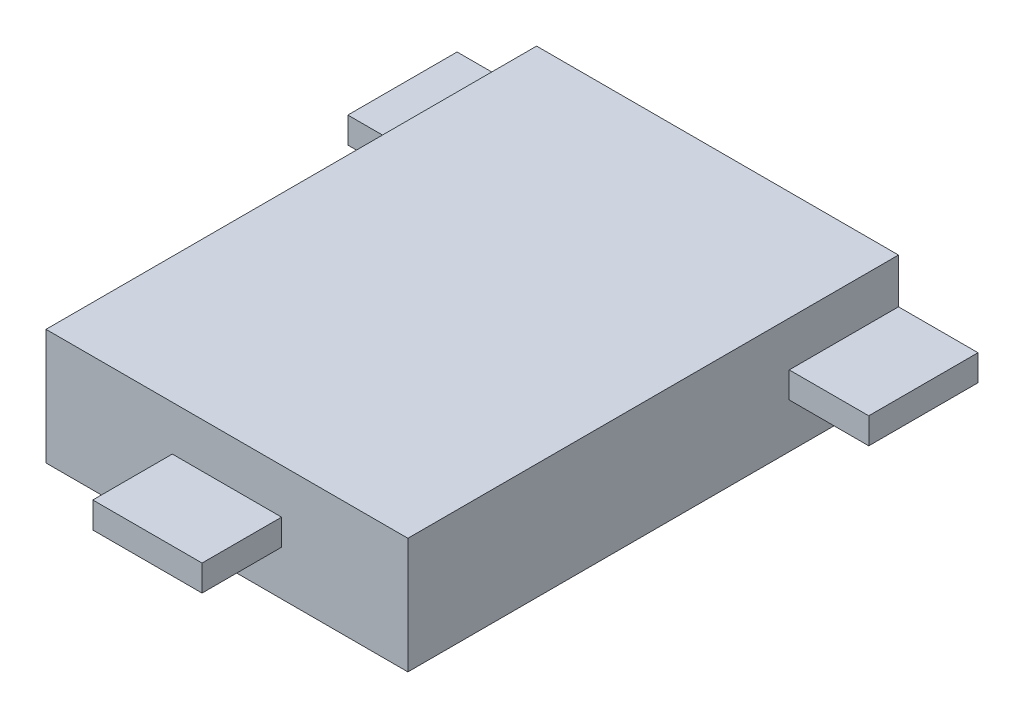
ISO-10303-21;
HEADER;
FILE_DESCRIPTION(('STEP AP214'),'2;1');
FILE_NAME('part.step','',(''),(''),'','','');
FILE_SCHEMA(('AUTOMOTIVE_DESIGN { 1 0 10303 214 1 1 1 1 }'));
ENDSEC;
DATA;
#1=APPLICATION_CONTEXT('core data for automotive mechanical design processes');
#2=APPLICATION_PROTOCOL_DEFINITION('international standard','automotive_design',2000,#1);
#3=PRODUCT_CONTEXT('',#1,'mechanical');
#4=PRODUCT('Part','Part','',(#3));
#5=PRODUCT_RELATED_PRODUCT_CATEGORY('part','',(#4));
#6=PRODUCT_DEFINITION_FORMATION('','',#4);
#7=PRODUCT_DEFINITION_CONTEXT('part definition',#1,'design');
#8=PRODUCT_DEFINITION('design','',#6,#7);
#9=PRODUCT_DEFINITION_SHAPE('','',#8);
#10=(LENGTH_UNIT() NAMED_UNIT(*) SI_UNIT(.MILLI.,.METRE.));
#11=(NAMED_UNIT(*) PLANE_ANGLE_UNIT() SI_UNIT($,.RADIAN.));
#12=(NAMED_UNIT(*) SI_UNIT($,.STERADIAN.) SOLID_ANGLE_UNIT());
#13=UNCERTAINTY_MEASURE_WITH_UNIT(LENGTH_MEASURE(1.E-05),#10,'distance_accuracy_value','');
#14=(GEOMETRIC_REPRESENTATION_CONTEXT(3) GLOBAL_UNCERTAINTY_ASSIGNED_CONTEXT((#13)) GLOBAL_UNIT_ASSIGNED_CONTEXT((#10,
#11,#12)) REPRESENTATION_CONTEXT('',''));
#15=CARTESIAN_POINT('',(0.,0.,0.));
#16=DIRECTION('',(0.,0.,1.));
#17=DIRECTION('',(1.,0.,0.));
#18=AXIS2_PLACEMENT_3D('',#15,#16,#17);
#19=CARTESIAN_POINT('',(-12.505,8.,16.9525));
#20=DIRECTION('',(1.,0.,0.));
#21=DIRECTION('',(0.,0.,-1.));
#22=AXIS2_PLACEMENT_3D('',#19,#20,#21);
#23=PLANE('',#22);
#24=DIRECTION('',(0.,0.,-1.));
#25=VECTOR('',#24,1.);
#26=CARTESIAN_POINT('',(-12.505,4.9,-16.9525));
#27=LINE('',#26,#25);
#28=CARTESIAN_POINT('',(-12.505,4.9,-9.4025));
#29=VERTEX_POINT('',#28);
#30=CARTESIAN_POINT('',(-12.505,4.9,-16.9525));
#31=VERTEX_POINT('',#30);
#32=EDGE_CURVE('E60',#29,#31,#27,.T.);
#33=ORIENTED_EDGE('',*,*,#32,.F.);
#34=DIRECTION('',(0.,1.,0.));
#35=VECTOR('',#34,1.);
#36=CARTESIAN_POINT('',(-12.505,3.1,-9.4025));
#37=LINE('',#36,#35);
#38=CARTESIAN_POINT('',(-12.505,3.1,-9.4025));
#39=VERTEX_POINT('',#38);
#40=EDGE_CURVE('E199',#39,#29,#37,.T.);
#41=ORIENTED_EDGE('',*,*,#40,.F.);
#42=DIRECTION('',(0.,0.,1.));
#43=VECTOR('',#42,1.);
#44=CARTESIAN_POINT('',(-12.505,3.1,-16.9525));
#45=LINE('',#44,#43);
#46=CARTESIAN_POINT('',(-12.505,3.1,-16.9525));
#47=VERTEX_POINT('',#46);
#48=EDGE_CURVE('E156',#47,#39,#45,.T.);
#49=ORIENTED_EDGE('',*,*,#48,.F.);
#50=DIRECTION('',(0.,-1.,0.));
#51=VECTOR('',#50,1.);
#52=CARTESIAN_POINT('',(-12.505,8.,-16.9525));
#53=LINE('',#52,#51);
#54=CARTESIAN_POINT('',(-12.505,0.,-16.9525));
#55=VERTEX_POINT('',#54);
#56=EDGE_CURVE('E269',#47,#55,#53,.T.);
#57=ORIENTED_EDGE('',*,*,#56,.T.);
#58=DIRECTION('',(0.,0.,1.));
#59=VECTOR('',#58,1.);
#60=CARTESIAN_POINT('',(-12.505,0.,16.9525));
#61=LINE('',#60,#59);
#62=CARTESIAN_POINT('',(-12.505,0.,16.9525));
#63=VERTEX_POINT('',#62);
#64=EDGE_CURVE('E262',#55,#63,#61,.T.);
#65=ORIENTED_EDGE('',*,*,#64,.T.);
#66=DIRECTION('',(0.,-1.,0.));
#67=VECTOR('',#66,1.);
#68=CARTESIAN_POINT('',(-12.505,8.,16.9525));
#69=LINE('',#68,#67);
#70=CARTESIAN_POINT('',(-12.505,8.,16.9525));
#71=VERTEX_POINT('',#70);
#72=EDGE_CURVE('E267',#71,#63,#69,.T.);
#73=ORIENTED_EDGE('',*,*,#72,.F.);
#74=DIRECTION('',(0.,0.,1.));
#75=VECTOR('',#74,1.);
#76=CARTESIAN_POINT('',(-12.505,8.,16.9525));
#77=LINE('',#76,#75);
#78=CARTESIAN_POINT('',(-12.505,8.,-16.9525));
#79=VERTEX_POINT('',#78);
#80=EDGE_CURVE('E253',#79,#71,#77,.T.);
#81=ORIENTED_EDGE('',*,*,#80,.F.);
#82=EDGE_CURVE('E270',#79,#31,#53,.T.);
#83=ORIENTED_EDGE('',*,*,#82,.T.);
#84=EDGE_LOOP('',(#33,#41,#49,#57,#65,#73,#81,#83));
#85=FACE_BOUND('',#84,.T.);
#86=ADVANCED_FACE('F37',(#85),#23,.F.);
#87=CARTESIAN_POINT('',(-12.505,8.,16.9525));
#88=DIRECTION('',(0.,0.,-1.));
#89=DIRECTION('',(-1.,0.,0.));
#90=AXIS2_PLACEMENT_3D('',#87,#88,#89);
#91=PLANE('',#90);
#92=DIRECTION('',(1.,0.,0.));
#93=VECTOR('',#92,1.);
#94=CARTESIAN_POINT('',(-12.505,0.,16.9525));
#95=LINE('',#94,#93);
#96=CARTESIAN_POINT('',(12.505,0.,16.9525));
#97=VERTEX_POINT('',#96);
#98=EDGE_CURVE('E251',#63,#97,#95,.T.);
#99=ORIENTED_EDGE('',*,*,#98,.T.);
#100=DIRECTION('',(0.,-1.,0.));
#101=VECTOR('',#100,1.);
#102=CARTESIAN_POINT('',(12.505,8.,16.9525));
#103=LINE('',#102,#101);
#104=CARTESIAN_POINT('',(12.505,8.,16.9525));
#105=VERTEX_POINT('',#104);
#106=EDGE_CURVE('E257',#105,#97,#103,.T.);
#107=ORIENTED_EDGE('',*,*,#106,.F.);
#108=DIRECTION('',(1.,0.,0.));
#109=VECTOR('',#108,1.);
#110=CARTESIAN_POINT('',(-12.505,8.,16.9525));
#111=LINE('',#110,#109);
#112=EDGE_CURVE('E255',#71,#105,#111,.T.);
#113=ORIENTED_EDGE('',*,*,#112,.F.);
#114=ORIENTED_EDGE('',*,*,#72,.T.);
#115=EDGE_LOOP('',(#99,#107,#113,#114));
#116=FACE_BOUND('',#115,.T.);
#117=DIRECTION('',(0.,1.,0.));
#118=VECTOR('',#117,1.);
#119=CARTESIAN_POINT('',(3.775,3.1,16.9525));
#120=LINE('',#119,#118);
#121=CARTESIAN_POINT('',(3.775,3.1,16.9525));
#122=VERTEX_POINT('',#121);
#123=CARTESIAN_POINT('',(3.775,4.9,16.9525));
#124=VERTEX_POINT('',#123);
#125=EDGE_CURVE('E213',#122,#124,#120,.T.);
#126=ORIENTED_EDGE('',*,*,#125,.F.);
#127=DIRECTION('',(1.,0.,0.));
#128=VECTOR('',#127,1.);
#129=CARTESIAN_POINT('',(-3.775,3.1,16.9525));
#130=LINE('',#129,#128);
#131=CARTESIAN_POINT('',(-3.775,3.1,16.9525));
#132=VERTEX_POINT('',#131);
#133=EDGE_CURVE('E218',#132,#122,#130,.T.);
#134=ORIENTED_EDGE('',*,*,#133,.F.);
#135=DIRECTION('',(0.,-1.,0.));
#136=VECTOR('',#135,1.);
#137=CARTESIAN_POINT('',(-3.775,3.1,16.9525));
#138=LINE('',#137,#136);
#139=CARTESIAN_POINT('',(-3.775,4.9,16.9525));
#140=VERTEX_POINT('',#139);
#141=EDGE_CURVE('E230',#140,#132,#138,.T.);
#142=ORIENTED_EDGE('',*,*,#141,.F.);
#143=DIRECTION('',(-1.,0.,0.));
#144=VECTOR('',#143,1.);
#145=CARTESIAN_POINT('',(-3.775,4.9,16.9525));
#146=LINE('',#145,#144);
#147=EDGE_CURVE('E227',#124,#140,#146,.T.);
#148=ORIENTED_EDGE('',*,*,#147,.F.);
#149=EDGE_LOOP('',(#126,#134,#142,#148));
#150=FACE_BOUND('',#149,.T.);
#151=ADVANCED_FACE('F285',(#116,#150),#91,.F.);
#152=CARTESIAN_POINT('',(12.505,8.,16.9525));
#153=DIRECTION('',(-1.,0.,0.));
#154=DIRECTION('',(0.,0.,1.));
#155=AXIS2_PLACEMENT_3D('',#152,#153,#154);
#156=PLANE('',#155);
#157=DIRECTION('',(0.,-1.,0.));
#158=VECTOR('',#157,1.);
#159=CARTESIAN_POINT('',(12.505,8.,-16.9525));
#160=LINE('',#159,#158);
#161=CARTESIAN_POINT('',(12.505,3.1,-16.9525));
#162=VERTEX_POINT('',#161);
#163=CARTESIAN_POINT('',(12.505,0.,-16.9525));
#164=VERTEX_POINT('',#163);
#165=EDGE_CURVE('E45',#162,#164,#160,.T.);
#166=ORIENTED_EDGE('',*,*,#165,.F.);
#167=DIRECTION('',(0.,0.,1.));
#168=VECTOR('',#167,1.);
#169=CARTESIAN_POINT('',(12.505,3.1,-16.9525));
#170=LINE('',#169,#168);
#171=CARTESIAN_POINT('',(12.505,3.1,-9.4025));
#172=VERTEX_POINT('',#171);
#173=EDGE_CURVE('E167',#162,#172,#170,.T.);
#174=ORIENTED_EDGE('',*,*,#173,.T.);
#175=DIRECTION('',(0.,1.,0.));
#176=VECTOR('',#175,1.);
#177=CARTESIAN_POINT('',(12.505,3.1,-9.4025));
#178=LINE('',#177,#176);
#179=CARTESIAN_POINT('',(12.505,4.9,-9.4025));
#180=VERTEX_POINT('',#179);
#181=EDGE_CURVE('E178',#172,#180,#178,.T.);
#182=ORIENTED_EDGE('',*,*,#181,.T.);
#183=DIRECTION('',(0.,0.,-1.));
#184=VECTOR('',#183,1.);
#185=CARTESIAN_POINT('',(12.505,4.9,-16.9525));
#186=LINE('',#185,#184);
#187=CARTESIAN_POINT('',(12.505,4.9,-16.9525));
#188=VERTEX_POINT('',#187);
#189=EDGE_CURVE('E176',#180,#188,#186,.T.);
#190=ORIENTED_EDGE('',*,*,#189,.T.);
#191=CARTESIAN_POINT('',(12.505,8.,-16.9525));
#192=VERTEX_POINT('',#191);
#193=EDGE_CURVE('E11',#192,#188,#160,.T.);
#194=ORIENTED_EDGE('',*,*,#193,.F.);
#195=DIRECTION('',(0.,0.,-1.));
#196=VECTOR('',#195,1.);
#197=CARTESIAN_POINT('',(12.505,8.,16.9525));
#198=LINE('',#197,#196);
#199=EDGE_CURVE('E247',#105,#192,#198,.T.);
#200=ORIENTED_EDGE('',*,*,#199,.F.);
#201=ORIENTED_EDGE('',*,*,#106,.T.);
#202=DIRECTION('',(0.,0.,-1.));
#203=VECTOR('',#202,1.);
#204=CARTESIAN_POINT('',(12.505,0.,16.9525));
#205=LINE('',#204,#203);
#206=EDGE_CURVE('E246',#97,#164,#205,.T.);
#207=ORIENTED_EDGE('',*,*,#206,.T.);
#208=EDGE_LOOP('',(#166,#174,#182,#190,#194,#200,#201,#207));
#209=FACE_BOUND('',#208,.T.);
#210=ADVANCED_FACE('F39',(#209),#156,.F.);
#211=CARTESIAN_POINT('',(-12.505,8.,-16.9525));
#212=DIRECTION('',(0.,0.,1.));
#213=DIRECTION('',(1.,0.,0.));
#214=AXIS2_PLACEMENT_3D('',#211,#212,#213);
#215=PLANE('',#214);
#216=DIRECTION('',(-1.,0.,0.));
#217=VECTOR('',#216,1.);
#218=CARTESIAN_POINT('',(-12.505,0.,-16.9525));
#219=LINE('',#218,#217);
#220=EDGE_CURVE('E260',#164,#55,#219,.T.);
#221=ORIENTED_EDGE('',*,*,#220,.T.);
#222=ORIENTED_EDGE('',*,*,#56,.F.);
#223=DIRECTION('',(1.,0.,0.));
#224=VECTOR('',#223,1.);
#225=CARTESIAN_POINT('',(-18.,3.1,-16.9525));
#226=LINE('',#225,#224);
#227=CARTESIAN_POINT('',(-18.,3.1,-16.9525));
#228=VERTEX_POINT('',#227);
#229=EDGE_CURVE('E210',#228,#47,#226,.T.);
#230=ORIENTED_EDGE('',*,*,#229,.F.);
#231=DIRECTION('',(0.,-1.,0.));
#232=VECTOR('',#231,1.);
#233=CARTESIAN_POINT('',(-18.,3.1,-16.9525));
#234=LINE('',#233,#232);
#235=CARTESIAN_POINT('',(-18.,4.9,-16.9525));
#236=VERTEX_POINT('',#235);
#237=EDGE_CURVE('E187',#236,#228,#234,.T.);
#238=ORIENTED_EDGE('',*,*,#237,.F.);
#239=DIRECTION('',(1.,0.,0.));
#240=VECTOR('',#239,1.);
#241=CARTESIAN_POINT('',(-18.,4.9,-16.9525));
#242=LINE('',#241,#240);
#243=EDGE_CURVE('E196',#236,#31,#242,.T.);
#244=ORIENTED_EDGE('',*,*,#243,.T.);
#245=ORIENTED_EDGE('',*,*,#82,.F.);
#246=DIRECTION('',(-1.,0.,0.));
#247=VECTOR('',#246,1.);
#248=CARTESIAN_POINT('',(-12.505,8.,-16.9525));
#249=LINE('',#248,#247);
#250=EDGE_CURVE('E250',#192,#79,#249,.T.);
#251=ORIENTED_EDGE('',*,*,#250,.F.);
#252=ORIENTED_EDGE('',*,*,#193,.T.);
#253=DIRECTION('',(-1.,0.,0.));
#254=VECTOR('',#253,1.);
#255=CARTESIAN_POINT('',(18.,4.9,-16.9525));
#256=LINE('',#255,#254);
#257=CARTESIAN_POINT('',(18.,4.9,-16.9525));
#258=VERTEX_POINT('',#257);
#259=EDGE_CURVE('E52',#258,#188,#256,.T.);
#260=ORIENTED_EDGE('',*,*,#259,.F.);
#261=DIRECTION('',(0.,-1.,0.));
#262=VECTOR('',#261,1.);
#263=CARTESIAN_POINT('',(18.,3.1,-16.9525));
#264=LINE('',#263,#262);
#265=CARTESIAN_POINT('',(18.,3.1,-16.9525));
#266=VERTEX_POINT('',#265);
#267=EDGE_CURVE('E153',#258,#266,#264,.T.);
#268=ORIENTED_EDGE('',*,*,#267,.T.);
#269=DIRECTION('',(-1.,0.,0.));
#270=VECTOR('',#269,1.);
#271=CARTESIAN_POINT('',(18.,3.1,-16.9525));
#272=LINE('',#271,#270);
#273=EDGE_CURVE('E175',#266,#162,#272,.T.);
#274=ORIENTED_EDGE('',*,*,#273,.T.);
#275=ORIENTED_EDGE('',*,*,#165,.T.);
#276=EDGE_LOOP('',(#221,#222,#230,#238,#244,#245,#251,#252,#260,#268,#274,#275));
#277=FACE_BOUND('',#276,.T.);
#278=ADVANCED_FACE('F152',(#277),#215,.F.);
#279=CARTESIAN_POINT('',(0.,8.,0.));
#280=DIRECTION('',(0.,-1.,0.));
#281=DIRECTION('',(0.,0.,-1.));
#282=AXIS2_PLACEMENT_3D('',#279,#280,#281);
#283=PLANE('',#282);
#284=ORIENTED_EDGE('',*,*,#199,.T.);
#285=ORIENTED_EDGE('',*,*,#250,.T.);
#286=ORIENTED_EDGE('',*,*,#80,.T.);
#287=ORIENTED_EDGE('',*,*,#112,.T.);
#288=EDGE_LOOP('',(#284,#285,#286,#287));
#289=FACE_BOUND('',#288,.T.);
#290=ADVANCED_FACE('F291',(#289),#283,.F.);
#291=CARTESIAN_POINT('',(0.,0.,0.));
#292=DIRECTION('',(0.,-1.,0.));
#293=DIRECTION('',(0.,0.,-1.));
#294=AXIS2_PLACEMENT_3D('',#291,#292,#293);
#295=PLANE('',#294);
#296=ORIENTED_EDGE('',*,*,#206,.F.);
#297=ORIENTED_EDGE('',*,*,#98,.F.);
#298=ORIENTED_EDGE('',*,*,#64,.F.);
#299=ORIENTED_EDGE('',*,*,#220,.F.);
#300=EDGE_LOOP('',(#296,#297,#298,#299));
#301=FACE_BOUND('',#300,.T.);
#302=ADVANCED_FACE('F282',(#301),#295,.T.);
#303=CARTESIAN_POINT('',(3.775,3.1,22.4475));
#304=DIRECTION('',(-1.,0.,0.));
#305=DIRECTION('',(0.,0.,1.));
#306=AXIS2_PLACEMENT_3D('',#303,#304,#305);
#307=PLANE('',#306);
#308=ORIENTED_EDGE('',*,*,#125,.T.);
#309=DIRECTION('',(0.,0.,-1.));
#310=VECTOR('',#309,1.);
#311=CARTESIAN_POINT('',(3.775,4.9,22.4475));
#312=LINE('',#311,#310);
#313=CARTESIAN_POINT('',(3.775,4.9,22.4475));
#314=VERTEX_POINT('',#313);
#315=EDGE_CURVE('E243',#314,#124,#312,.T.);
#316=ORIENTED_EDGE('',*,*,#315,.F.);
#317=DIRECTION('',(0.,1.,0.));
#318=VECTOR('',#317,1.);
#319=CARTESIAN_POINT('',(3.775,3.1,22.4475));
#320=LINE('',#319,#318);
#321=CARTESIAN_POINT('',(3.775,3.1,22.4475));
#322=VERTEX_POINT('',#321);
#323=EDGE_CURVE('E214',#322,#314,#320,.T.);
#324=ORIENTED_EDGE('',*,*,#323,.F.);
#325=DIRECTION('',(0.,0.,-1.));
#326=VECTOR('',#325,1.);
#327=CARTESIAN_POINT('',(3.775,3.1,22.4475));
#328=LINE('',#327,#326);
#329=EDGE_CURVE('E224',#322,#122,#328,.T.);
#330=ORIENTED_EDGE('',*,*,#329,.T.);
#331=EDGE_LOOP('',(#308,#316,#324,#330));
#332=FACE_BOUND('',#331,.T.);
#333=ADVANCED_FACE('F345',(#332),#307,.F.);
#334=CARTESIAN_POINT('',(-3.775,4.9,22.4475));
#335=DIRECTION('',(0.,-1.,0.));
#336=DIRECTION('',(0.,0.,-1.));
#337=AXIS2_PLACEMENT_3D('',#334,#335,#336);
#338=PLANE('',#337);
#339=ORIENTED_EDGE('',*,*,#147,.T.);
#340=DIRECTION('',(0.,0.,-1.));
#341=VECTOR('',#340,1.);
#342=CARTESIAN_POINT('',(-3.775,4.9,22.4475));
#343=LINE('',#342,#341);
#344=CARTESIAN_POINT('',(-3.775,4.9,22.4475));
#345=VERTEX_POINT('',#344);
#346=EDGE_CURVE('E240',#345,#140,#343,.T.);
#347=ORIENTED_EDGE('',*,*,#346,.F.);
#348=DIRECTION('',(-1.,0.,0.));
#349=VECTOR('',#348,1.);
#350=CARTESIAN_POINT('',(-3.775,4.9,22.4475));
#351=LINE('',#350,#349);
#352=EDGE_CURVE('E217',#314,#345,#351,.T.);
#353=ORIENTED_EDGE('',*,*,#352,.F.);
#354=ORIENTED_EDGE('',*,*,#315,.T.);
#355=EDGE_LOOP('',(#339,#347,#353,#354));
#356=FACE_BOUND('',#355,.T.);
#357=ADVANCED_FACE('F349',(#356),#338,.F.);
#358=CARTESIAN_POINT('',(-3.775,3.1,22.4475));
#359=DIRECTION('',(1.,0.,0.));
#360=DIRECTION('',(0.,0.,-1.));
#361=AXIS2_PLACEMENT_3D('',#358,#359,#360);
#362=PLANE('',#361);
#363=ORIENTED_EDGE('',*,*,#141,.T.);
#364=DIRECTION('',(0.,0.,-1.));
#365=VECTOR('',#364,1.);
#366=CARTESIAN_POINT('',(-3.775,3.1,22.4475));
#367=LINE('',#366,#365);
#368=CARTESIAN_POINT('',(-3.775,3.1,22.4475));
#369=VERTEX_POINT('',#368);
#370=EDGE_CURVE('E237',#369,#132,#367,.T.);
#371=ORIENTED_EDGE('',*,*,#370,.F.);
#372=DIRECTION('',(0.,-1.,0.));
#373=VECTOR('',#372,1.);
#374=CARTESIAN_POINT('',(-3.775,3.1,22.4475));
#375=LINE('',#374,#373);
#376=EDGE_CURVE('E220',#345,#369,#375,.T.);
#377=ORIENTED_EDGE('',*,*,#376,.F.);
#378=ORIENTED_EDGE('',*,*,#346,.T.);
#379=EDGE_LOOP('',(#363,#371,#377,#378));
#380=FACE_BOUND('',#379,.T.);
#381=ADVANCED_FACE('F359',(#380),#362,.F.);
#382=CARTESIAN_POINT('',(-3.775,3.1,22.4475));
#383=DIRECTION('',(0.,1.,0.));
#384=DIRECTION('',(0.,0.,1.));
#385=AXIS2_PLACEMENT_3D('',#382,#383,#384);
#386=PLANE('',#385);
#387=ORIENTED_EDGE('',*,*,#133,.T.);
#388=ORIENTED_EDGE('',*,*,#329,.F.);
#389=DIRECTION('',(1.,0.,0.));
#390=VECTOR('',#389,1.);
#391=CARTESIAN_POINT('',(-3.775,3.1,22.4475));
#392=LINE('',#391,#390);
#393=EDGE_CURVE('E222',#369,#322,#392,.T.);
#394=ORIENTED_EDGE('',*,*,#393,.F.);
#395=ORIENTED_EDGE('',*,*,#370,.T.);
#396=EDGE_LOOP('',(#387,#388,#394,#395));
#397=FACE_BOUND('',#396,.T.);
#398=ADVANCED_FACE('F369',(#397),#386,.F.);
#399=CARTESIAN_POINT('',(0.,0.,22.4475));
#400=DIRECTION('',(0.,0.,-1.));
#401=DIRECTION('',(-1.,0.,0.));
#402=AXIS2_PLACEMENT_3D('',#399,#400,#401);
#403=PLANE('',#402);
#404=ORIENTED_EDGE('',*,*,#323,.T.);
#405=ORIENTED_EDGE('',*,*,#352,.T.);
#406=ORIENTED_EDGE('',*,*,#376,.T.);
#407=ORIENTED_EDGE('',*,*,#393,.T.);
#408=EDGE_LOOP('',(#404,#405,#406,#407));
#409=FACE_BOUND('',#408,.T.);
#410=ADVANCED_FACE('F379',(#409),#403,.F.);
#411=CARTESIAN_POINT('',(-18.,3.1,-16.9525));
#412=DIRECTION('',(0.,1.,0.));
#413=DIRECTION('',(0.,0.,1.));
#414=AXIS2_PLACEMENT_3D('',#411,#412,#413);
#415=PLANE('',#414);
#416=ORIENTED_EDGE('',*,*,#48,.T.);
#417=DIRECTION('',(1.,0.,0.));
#418=VECTOR('',#417,1.);
#419=CARTESIAN_POINT('',(-18.,3.1,-9.4025));
#420=LINE('',#419,#418);
#421=CARTESIAN_POINT('',(-18.,3.1,-9.4025));
#422=VERTEX_POINT('',#421);
#423=EDGE_CURVE('E207',#422,#39,#420,.T.);
#424=ORIENTED_EDGE('',*,*,#423,.F.);
#425=DIRECTION('',(0.,0.,1.));
#426=VECTOR('',#425,1.);
#427=CARTESIAN_POINT('',(-18.,3.1,-16.9525));
#428=LINE('',#427,#426);
#429=EDGE_CURVE('E190',#228,#422,#428,.T.);
#430=ORIENTED_EDGE('',*,*,#429,.F.);
#431=ORIENTED_EDGE('',*,*,#229,.T.);
#432=EDGE_LOOP('',(#416,#424,#430,#431));
#433=FACE_BOUND('',#432,.T.);
#434=ADVANCED_FACE('F303',(#433),#415,.F.);
#435=CARTESIAN_POINT('',(-18.,3.1,-9.4025));
#436=DIRECTION('',(0.,0.,-1.));
#437=DIRECTION('',(-1.,0.,0.));
#438=AXIS2_PLACEMENT_3D('',#435,#436,#437);
#439=PLANE('',#438);
#440=ORIENTED_EDGE('',*,*,#40,.T.);
#441=DIRECTION('',(1.,0.,0.));
#442=VECTOR('',#441,1.);
#443=CARTESIAN_POINT('',(-18.,4.9,-9.4025));
#444=LINE('',#443,#442);
#445=CARTESIAN_POINT('',(-18.,4.9,-9.4025));
#446=VERTEX_POINT('',#445);
#447=EDGE_CURVE('E204',#446,#29,#444,.T.);
#448=ORIENTED_EDGE('',*,*,#447,.F.);
#449=DIRECTION('',(0.,1.,0.));
#450=VECTOR('',#449,1.);
#451=CARTESIAN_POINT('',(-18.,3.1,-9.4025));
#452=LINE('',#451,#450);
#453=EDGE_CURVE('E192',#422,#446,#452,.T.);
#454=ORIENTED_EDGE('',*,*,#453,.F.);
#455=ORIENTED_EDGE('',*,*,#423,.T.);
#456=EDGE_LOOP('',(#440,#448,#454,#455));
#457=FACE_BOUND('',#456,.T.);
#458=ADVANCED_FACE('F300',(#457),#439,.F.);
#459=CARTESIAN_POINT('',(-18.,4.9,-16.9525));
#460=DIRECTION('',(0.,-1.,0.));
#461=DIRECTION('',(0.,0.,-1.));
#462=AXIS2_PLACEMENT_3D('',#459,#460,#461);
#463=PLANE('',#462);
#464=ORIENTED_EDGE('',*,*,#32,.T.);
#465=ORIENTED_EDGE('',*,*,#243,.F.);
#466=DIRECTION('',(0.,0.,-1.));
#467=VECTOR('',#466,1.);
#468=CARTESIAN_POINT('',(-18.,4.9,-16.9525));
#469=LINE('',#468,#467);
#470=EDGE_CURVE('E194',#446,#236,#469,.T.);
#471=ORIENTED_EDGE('',*,*,#470,.F.);
#472=ORIENTED_EDGE('',*,*,#447,.T.);
#473=EDGE_LOOP('',(#464,#465,#471,#472));
#474=FACE_BOUND('',#473,.T.);
#475=ADVANCED_FACE('F296',(#474),#463,.F.);
#476=CARTESIAN_POINT('',(-18.,0.,0.));
#477=DIRECTION('',(1.,0.,0.));
#478=DIRECTION('',(0.,0.,-1.));
#479=AXIS2_PLACEMENT_3D('',#476,#477,#478);
#480=PLANE('',#479);
#481=ORIENTED_EDGE('',*,*,#237,.T.);
#482=ORIENTED_EDGE('',*,*,#429,.T.);
#483=ORIENTED_EDGE('',*,*,#453,.T.);
#484=ORIENTED_EDGE('',*,*,#470,.T.);
#485=EDGE_LOOP('',(#481,#482,#483,#484));
#486=FACE_BOUND('',#485,.T.);
#487=ADVANCED_FACE('F305',(#486),#480,.F.);
#488=CARTESIAN_POINT('',(18.,4.9,-16.9525));
#489=DIRECTION('',(0.,1.,0.));
#490=DIRECTION('',(0.,0.,1.));
#491=AXIS2_PLACEMENT_3D('',#488,#489,#490);
#492=PLANE('',#491);
#493=ORIENTED_EDGE('',*,*,#189,.F.);
#494=DIRECTION('',(-1.,0.,0.));
#495=VECTOR('',#494,1.);
#496=CARTESIAN_POINT('',(18.,4.9,-9.4025));
#497=LINE('',#496,#495);
#498=CARTESIAN_POINT('',(18.,4.9,-9.4025));
#499=VERTEX_POINT('',#498);
#500=EDGE_CURVE('E157',#499,#180,#497,.T.);
#501=ORIENTED_EDGE('',*,*,#500,.F.);
#502=DIRECTION('',(0.,0.,-1.));
#503=VECTOR('',#502,1.);
#504=CARTESIAN_POINT('',(18.,4.9,-16.9525));
#505=LINE('',#504,#503);
#506=EDGE_CURVE('E163',#499,#258,#505,.T.);
#507=ORIENTED_EDGE('',*,*,#506,.T.);
#508=ORIENTED_EDGE('',*,*,#259,.T.);
#509=EDGE_LOOP('',(#493,#501,#507,#508));
#510=FACE_BOUND('',#509,.T.);
#511=ADVANCED_FACE('F169',(#510),#492,.T.);
#512=CARTESIAN_POINT('',(18.,3.1,-9.4025));
#513=DIRECTION('',(0.,0.,1.));
#514=DIRECTION('',(1.,0.,0.));
#515=AXIS2_PLACEMENT_3D('',#512,#513,#514);
#516=PLANE('',#515);
#517=ORIENTED_EDGE('',*,*,#181,.F.);
#518=DIRECTION('',(-1.,0.,0.));
#519=VECTOR('',#518,1.);
#520=CARTESIAN_POINT('',(18.,3.1,-9.4025));
#521=LINE('',#520,#519);
#522=CARTESIAN_POINT('',(18.,3.1,-9.4025));
#523=VERTEX_POINT('',#522);
#524=EDGE_CURVE('E184',#523,#172,#521,.T.);
#525=ORIENTED_EDGE('',*,*,#524,.F.);
#526=DIRECTION('',(0.,1.,0.));
#527=VECTOR('',#526,1.);
#528=CARTESIAN_POINT('',(18.,3.1,-9.4025));
#529=LINE('',#528,#527);
#530=EDGE_CURVE('E170',#523,#499,#529,.T.);
#531=ORIENTED_EDGE('',*,*,#530,.T.);
#532=ORIENTED_EDGE('',*,*,#500,.T.);
#533=EDGE_LOOP('',(#517,#525,#531,#532));
#534=FACE_BOUND('',#533,.T.);
#535=ADVANCED_FACE('F312',(#534),#516,.T.);
#536=CARTESIAN_POINT('',(18.,3.1,-16.9525));
#537=DIRECTION('',(0.,-1.,0.));
#538=DIRECTION('',(0.,0.,-1.));
#539=AXIS2_PLACEMENT_3D('',#536,#537,#538);
#540=PLANE('',#539);
#541=ORIENTED_EDGE('',*,*,#173,.F.);
#542=ORIENTED_EDGE('',*,*,#273,.F.);
#543=DIRECTION('',(0.,0.,1.));
#544=VECTOR('',#543,1.);
#545=CARTESIAN_POINT('',(18.,3.1,-16.9525));
#546=LINE('',#545,#544);
#547=EDGE_CURVE('E166',#266,#523,#546,.T.);
#548=ORIENTED_EDGE('',*,*,#547,.T.);
#549=ORIENTED_EDGE('',*,*,#524,.T.);
#550=EDGE_LOOP('',(#541,#542,#548,#549));
#551=FACE_BOUND('',#550,.T.);
#552=ADVANCED_FACE('F442',(#551),#540,.T.);
#553=CARTESIAN_POINT('',(18.,0.,0.));
#554=DIRECTION('',(-1.,0.,0.));
#555=DIRECTION('',(0.,0.,-1.));
#556=AXIS2_PLACEMENT_3D('',#553,#554,#555);
#557=PLANE('',#556);
#558=ORIENTED_EDGE('',*,*,#267,.F.);
#559=ORIENTED_EDGE('',*,*,#506,.F.);
#560=ORIENTED_EDGE('',*,*,#530,.F.);
#561=ORIENTED_EDGE('',*,*,#547,.F.);
#562=EDGE_LOOP('',(#558,#559,#560,#561));
#563=FACE_BOUND('',#562,.T.);
#564=ADVANCED_FACE('F161',(#563),#557,.F.);
#565=CLOSED_SHELL('',(#86,#151,#210,#278,#290,#302,#333,#357,#381,#398,#410,#434,#458,#475,#487,
#511,#535,#552,#564));
#566=MANIFOLD_SOLID_BREP('B2',#565);
#567=ADVANCED_BREP_SHAPE_REPRESENTATION('',(#18,#566),#14);
#568=SHAPE_DEFINITION_REPRESENTATION(#9,#567);
ENDSEC;
END-ISO-10303-21;
